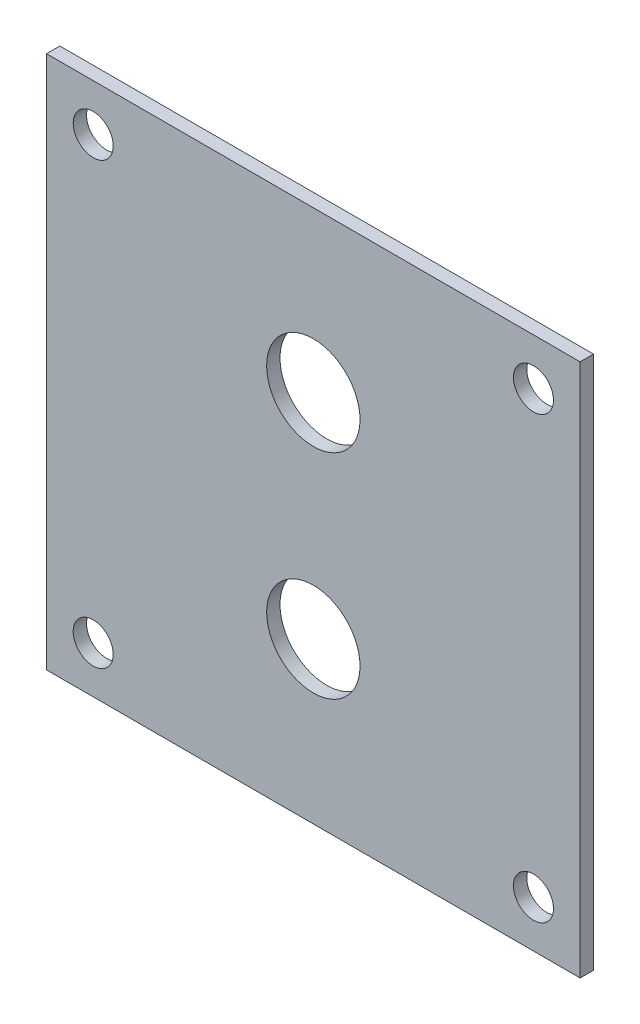
ISO-10303-21;
HEADER;
FILE_DESCRIPTION(('STEP AP214'),'2;1');
FILE_NAME('part.step','',(''),(''),'','','');
FILE_SCHEMA(('AUTOMOTIVE_DESIGN { 1 0 10303 214 1 1 1 1 }'));
ENDSEC;
DATA;
#1=APPLICATION_CONTEXT('core data for automotive mechanical design processes');
#2=APPLICATION_PROTOCOL_DEFINITION('international standard','automotive_design',2000,#1);
#3=PRODUCT_CONTEXT('',#1,'mechanical');
#4=PRODUCT('Part','Part','',(#3));
#5=PRODUCT_RELATED_PRODUCT_CATEGORY('part','',(#4));
#6=PRODUCT_DEFINITION_FORMATION('','',#4);
#7=PRODUCT_DEFINITION_CONTEXT('part definition',#1,'design');
#8=PRODUCT_DEFINITION('design','',#6,#7);
#9=PRODUCT_DEFINITION_SHAPE('','',#8);
#10=(LENGTH_UNIT() NAMED_UNIT(*) SI_UNIT(.MILLI.,.METRE.));
#11=(NAMED_UNIT(*) PLANE_ANGLE_UNIT() SI_UNIT($,.RADIAN.));
#12=(NAMED_UNIT(*) SI_UNIT($,.STERADIAN.) SOLID_ANGLE_UNIT());
#13=UNCERTAINTY_MEASURE_WITH_UNIT(LENGTH_MEASURE(1.E-05),#10,'distance_accuracy_value','');
#14=(GEOMETRIC_REPRESENTATION_CONTEXT(3) GLOBAL_UNCERTAINTY_ASSIGNED_CONTEXT((#13)) GLOBAL_UNIT_ASSIGNED_CONTEXT((#10,
#11,#12)) REPRESENTATION_CONTEXT('',''));
#15=CARTESIAN_POINT('',(0.,0.,0.));
#16=DIRECTION('',(0.,0.,1.));
#17=DIRECTION('',(1.,0.,0.));
#18=AXIS2_PLACEMENT_3D('',#15,#16,#17);
#19=CARTESIAN_POINT('',(63.5,63.5,3.175));
#20=DIRECTION('',(-1.,0.,0.));
#21=DIRECTION('',(0.,-1.,0.));
#22=AXIS2_PLACEMENT_3D('',#19,#20,#21);
#23=PLANE('',#22);
#24=DIRECTION('',(0.,1.,0.));
#25=VECTOR('',#24,1.);
#26=CARTESIAN_POINT('',(63.5,63.5,0.));
#27=LINE('',#26,#25);
#28=CARTESIAN_POINT('',(63.5,-63.5,0.));
#29=VERTEX_POINT('',#28);
#30=CARTESIAN_POINT('',(63.5,63.5,0.));
#31=VERTEX_POINT('',#30);
#32=EDGE_CURVE('E95',#29,#31,#27,.T.);
#33=ORIENTED_EDGE('',*,*,#32,.T.);
#34=DIRECTION('',(0.,0.,-1.));
#35=VECTOR('',#34,1.);
#36=CARTESIAN_POINT('',(63.5,63.5,3.175));
#37=LINE('',#36,#35);
#38=CARTESIAN_POINT('',(63.5,63.5,3.175));
#39=VERTEX_POINT('',#38);
#40=EDGE_CURVE('E11',#39,#31,#37,.T.);
#41=ORIENTED_EDGE('',*,*,#40,.F.);
#42=DIRECTION('',(0.,1.,0.));
#43=VECTOR('',#42,1.);
#44=CARTESIAN_POINT('',(63.5,63.5,3.175));
#45=LINE('',#44,#43);
#46=CARTESIAN_POINT('',(63.5,-63.5,3.175));
#47=VERTEX_POINT('',#46);
#48=EDGE_CURVE('E83',#47,#39,#45,.T.);
#49=ORIENTED_EDGE('',*,*,#48,.F.);
#50=DIRECTION('',(0.,0.,-1.));
#51=VECTOR('',#50,1.);
#52=CARTESIAN_POINT('',(63.5,-63.5,3.175));
#53=LINE('',#52,#51);
#54=EDGE_CURVE('E91',#47,#29,#53,.T.);
#55=ORIENTED_EDGE('',*,*,#54,.T.);
#56=EDGE_LOOP('',(#33,#41,#49,#55));
#57=FACE_BOUND('',#56,.T.);
#58=ADVANCED_FACE('F32',(#57),#23,.F.);
#59=CARTESIAN_POINT('',(-63.5,63.5,3.175));
#60=DIRECTION('',(0.,-1.,0.));
#61=DIRECTION('',(0.,0.,-1.));
#62=AXIS2_PLACEMENT_3D('',#59,#60,#61);
#63=PLANE('',#62);
#64=DIRECTION('',(-1.,0.,0.));
#65=VECTOR('',#64,1.);
#66=CARTESIAN_POINT('',(-63.5,63.5,0.));
#67=LINE('',#66,#65);
#68=CARTESIAN_POINT('',(-63.5,63.5,0.));
#69=VERTEX_POINT('',#68);
#70=EDGE_CURVE('E87',#31,#69,#67,.T.);
#71=ORIENTED_EDGE('',*,*,#70,.T.);
#72=DIRECTION('',(0.,0.,-1.));
#73=VECTOR('',#72,1.);
#74=CARTESIAN_POINT('',(-63.5,63.5,3.175));
#75=LINE('',#74,#73);
#76=CARTESIAN_POINT('',(-63.5,63.5,3.175));
#77=VERTEX_POINT('',#76);
#78=EDGE_CURVE('E40',#77,#69,#75,.T.);
#79=ORIENTED_EDGE('',*,*,#78,.F.);
#80=DIRECTION('',(-1.,0.,0.));
#81=VECTOR('',#80,1.);
#82=CARTESIAN_POINT('',(-63.5,63.5,3.175));
#83=LINE('',#82,#81);
#84=EDGE_CURVE('E78',#39,#77,#83,.T.);
#85=ORIENTED_EDGE('',*,*,#84,.F.);
#86=ORIENTED_EDGE('',*,*,#40,.T.);
#87=EDGE_LOOP('',(#71,#79,#85,#86));
#88=FACE_BOUND('',#87,.T.);
#89=ADVANCED_FACE('F86',(#88),#63,.F.);
#90=CARTESIAN_POINT('',(-63.5,63.5,3.175));
#91=DIRECTION('',(1.,0.,0.));
#92=DIRECTION('',(0.,1.,0.));
#93=AXIS2_PLACEMENT_3D('',#90,#91,#92);
#94=PLANE('',#93);
#95=DIRECTION('',(0.,-1.,0.));
#96=VECTOR('',#95,1.);
#97=CARTESIAN_POINT('',(-63.5,63.5,0.));
#98=LINE('',#97,#96);
#99=CARTESIAN_POINT('',(-63.5,-63.5,0.));
#100=VERTEX_POINT('',#99);
#101=EDGE_CURVE('E65',#69,#100,#98,.T.);
#102=ORIENTED_EDGE('',*,*,#101,.T.);
#103=DIRECTION('',(0.,0.,-1.));
#104=VECTOR('',#103,1.);
#105=CARTESIAN_POINT('',(-63.5,-63.5,3.175));
#106=LINE('',#105,#104);
#107=CARTESIAN_POINT('',(-63.5,-63.5,3.175));
#108=VERTEX_POINT('',#107);
#109=EDGE_CURVE('E88',#108,#100,#106,.T.);
#110=ORIENTED_EDGE('',*,*,#109,.F.);
#111=DIRECTION('',(0.,-1.,0.));
#112=VECTOR('',#111,1.);
#113=CARTESIAN_POINT('',(-63.5,63.5,3.175));
#114=LINE('',#113,#112);
#115=EDGE_CURVE('E81',#77,#108,#114,.T.);
#116=ORIENTED_EDGE('',*,*,#115,.F.);
#117=ORIENTED_EDGE('',*,*,#78,.T.);
#118=EDGE_LOOP('',(#102,#110,#116,#117));
#119=FACE_BOUND('',#118,.T.);
#120=ADVANCED_FACE('F89',(#119),#94,.F.);
#121=CARTESIAN_POINT('',(-63.5,-63.5,3.175));
#122=DIRECTION('',(0.,1.,0.));
#123=DIRECTION('',(0.,0.,1.));
#124=AXIS2_PLACEMENT_3D('',#121,#122,#123);
#125=PLANE('',#124);
#126=DIRECTION('',(1.,0.,0.));
#127=VECTOR('',#126,1.);
#128=CARTESIAN_POINT('',(-63.5,-63.5,0.));
#129=LINE('',#128,#127);
#130=EDGE_CURVE('E71',#100,#29,#129,.T.);
#131=ORIENTED_EDGE('',*,*,#130,.T.);
#132=ORIENTED_EDGE('',*,*,#54,.F.);
#133=DIRECTION('',(1.,0.,0.));
#134=VECTOR('',#133,1.);
#135=CARTESIAN_POINT('',(-63.5,-63.5,3.175));
#136=LINE('',#135,#134);
#137=EDGE_CURVE('E48',#108,#47,#136,.T.);
#138=ORIENTED_EDGE('',*,*,#137,.F.);
#139=ORIENTED_EDGE('',*,*,#109,.T.);
#140=EDGE_LOOP('',(#131,#132,#138,#139));
#141=FACE_BOUND('',#140,.T.);
#142=ADVANCED_FACE('F103',(#141),#125,.F.);
#143=CARTESIAN_POINT('',(0.,0.,3.175));
#144=DIRECTION('',(0.,0.,1.));
#145=DIRECTION('',(1.,0.,0.));
#146=AXIS2_PLACEMENT_3D('',#143,#144,#145);
#147=PLANE('',#146);
#148=CARTESIAN_POINT('',(52.3875,-52.3875,3.175));
#149=DIRECTION('',(0.,0.,1.));
#150=DIRECTION('',(1.,0.,0.));
#151=AXIS2_PLACEMENT_3D('',#148,#149,#150);
#152=CIRCLE('',#151,4.7625);
#153=CARTESIAN_POINT('',(57.15,-52.3875,3.175));
#154=VERTEX_POINT('',#153);
#155=EDGE_CURVE('E138',#154,#154,#152,.F.);
#156=ORIENTED_EDGE('',*,*,#155,.T.);
#157=EDGE_LOOP('',(#156));
#158=FACE_BOUND('',#157,.T.);
#159=CARTESIAN_POINT('',(52.3875,52.3875,3.175));
#160=DIRECTION('',(0.,0.,1.));
#161=DIRECTION('',(1.,0.,0.));
#162=AXIS2_PLACEMENT_3D('',#159,#160,#161);
#163=CIRCLE('',#162,4.7625);
#164=CARTESIAN_POINT('',(57.15,52.3875,3.175));
#165=VERTEX_POINT('',#164);
#166=EDGE_CURVE('E132',#165,#165,#163,.F.);
#167=ORIENTED_EDGE('',*,*,#166,.T.);
#168=EDGE_LOOP('',(#167));
#169=FACE_BOUND('',#168,.T.);
#170=CARTESIAN_POINT('',(-52.3875,-52.3875,3.175));
#171=DIRECTION('',(0.,0.,1.));
#172=DIRECTION('',(1.,0.,0.));
#173=AXIS2_PLACEMENT_3D('',#170,#171,#172);
#174=CIRCLE('',#173,4.7625);
#175=CARTESIAN_POINT('',(-47.625,-52.3875,3.175));
#176=VERTEX_POINT('',#175);
#177=EDGE_CURVE('E126',#176,#176,#174,.F.);
#178=ORIENTED_EDGE('',*,*,#177,.T.);
#179=EDGE_LOOP('',(#178));
#180=FACE_BOUND('',#179,.T.);
#181=CARTESIAN_POINT('',(-52.3875,52.3875,3.175));
#182=DIRECTION('',(0.,0.,1.));
#183=DIRECTION('',(1.,0.,0.));
#184=AXIS2_PLACEMENT_3D('',#181,#182,#183);
#185=CIRCLE('',#184,4.7625);
#186=CARTESIAN_POINT('',(-47.625,52.3875,3.175));
#187=VERTEX_POINT('',#186);
#188=EDGE_CURVE('E120',#187,#187,#185,.F.);
#189=ORIENTED_EDGE('',*,*,#188,.T.);
#190=EDGE_LOOP('',(#189));
#191=FACE_BOUND('',#190,.T.);
#192=CARTESIAN_POINT('',(0.,-25.4,3.175));
#193=DIRECTION('',(0.,0.,1.));
#194=DIRECTION('',(1.,0.,0.));
#195=AXIS2_PLACEMENT_3D('',#192,#193,#194);
#196=CIRCLE('',#195,11.1125);
#197=CARTESIAN_POINT('',(11.1125,-25.4,3.175));
#198=VERTEX_POINT('',#197);
#199=EDGE_CURVE('E114',#198,#198,#196,.F.);
#200=ORIENTED_EDGE('',*,*,#199,.T.);
#201=EDGE_LOOP('',(#200));
#202=FACE_BOUND('',#201,.T.);
#203=CARTESIAN_POINT('',(0.,25.4,3.175));
#204=DIRECTION('',(0.,0.,1.));
#205=DIRECTION('',(1.,0.,0.));
#206=AXIS2_PLACEMENT_3D('',#203,#204,#205);
#207=CIRCLE('',#206,11.1125);
#208=CARTESIAN_POINT('',(11.1125,25.4,3.175));
#209=VERTEX_POINT('',#208);
#210=EDGE_CURVE('E98',#209,#209,#207,.F.);
#211=ORIENTED_EDGE('',*,*,#210,.T.);
#212=EDGE_LOOP('',(#211));
#213=FACE_BOUND('',#212,.T.);
#214=ORIENTED_EDGE('',*,*,#48,.T.);
#215=ORIENTED_EDGE('',*,*,#84,.T.);
#216=ORIENTED_EDGE('',*,*,#115,.T.);
#217=ORIENTED_EDGE('',*,*,#137,.T.);
#218=EDGE_LOOP('',(#214,#215,#216,#217));
#219=FACE_BOUND('',#218,.T.);
#220=ADVANCED_FACE('F79',(#158,#169,#180,#191,#202,#213,#219),#147,.T.);
#221=CARTESIAN_POINT('',(0.,0.,0.));
#222=DIRECTION('',(0.,0.,1.));
#223=DIRECTION('',(1.,0.,0.));
#224=AXIS2_PLACEMENT_3D('',#221,#222,#223);
#225=PLANE('',#224);
#226=CARTESIAN_POINT('',(52.3875,-52.3875,0.));
#227=DIRECTION('',(0.,0.,-1.));
#228=DIRECTION('',(-1.,0.,0.));
#229=AXIS2_PLACEMENT_3D('',#226,#227,#228);
#230=CIRCLE('',#229,4.7625);
#231=CARTESIAN_POINT('',(47.625,-52.3875,0.));
#232=VERTEX_POINT('',#231);
#233=EDGE_CURVE('E141',#232,#232,#230,.T.);
#234=ORIENTED_EDGE('',*,*,#233,.F.);
#235=EDGE_LOOP('',(#234));
#236=FACE_BOUND('',#235,.T.);
#237=CARTESIAN_POINT('',(52.3875,52.3875,0.));
#238=DIRECTION('',(0.,0.,-1.));
#239=DIRECTION('',(1.,0.,0.));
#240=AXIS2_PLACEMENT_3D('',#237,#238,#239);
#241=CIRCLE('',#240,4.7625);
#242=CARTESIAN_POINT('',(57.15,52.3875,0.));
#243=VERTEX_POINT('',#242);
#244=EDGE_CURVE('E135',#243,#243,#241,.T.);
#245=ORIENTED_EDGE('',*,*,#244,.F.);
#246=EDGE_LOOP('',(#245));
#247=FACE_BOUND('',#246,.T.);
#248=CARTESIAN_POINT('',(-52.3875,-52.3875,0.));
#249=DIRECTION('',(0.,0.,-1.));
#250=DIRECTION('',(1.,0.,0.));
#251=AXIS2_PLACEMENT_3D('',#248,#249,#250);
#252=CIRCLE('',#251,4.7625);
#253=CARTESIAN_POINT('',(-47.625,-52.3875,0.));
#254=VERTEX_POINT('',#253);
#255=EDGE_CURVE('E129',#254,#254,#252,.T.);
#256=ORIENTED_EDGE('',*,*,#255,.F.);
#257=EDGE_LOOP('',(#256));
#258=FACE_BOUND('',#257,.T.);
#259=CARTESIAN_POINT('',(-52.3875,52.3875,0.));
#260=DIRECTION('',(0.,0.,-1.));
#261=DIRECTION('',(-1.,0.,0.));
#262=AXIS2_PLACEMENT_3D('',#259,#260,#261);
#263=CIRCLE('',#262,4.7625);
#264=CARTESIAN_POINT('',(-57.15,52.3875,0.));
#265=VERTEX_POINT('',#264);
#266=EDGE_CURVE('E123',#265,#265,#263,.T.);
#267=ORIENTED_EDGE('',*,*,#266,.F.);
#268=EDGE_LOOP('',(#267));
#269=FACE_BOUND('',#268,.T.);
#270=CARTESIAN_POINT('',(0.,-25.4,0.));
#271=DIRECTION('',(0.,0.,-1.));
#272=DIRECTION('',(-1.,0.,0.));
#273=AXIS2_PLACEMENT_3D('',#270,#271,#272);
#274=CIRCLE('',#273,11.1125);
#275=CARTESIAN_POINT('',(-11.1125,-25.4,0.));
#276=VERTEX_POINT('',#275);
#277=EDGE_CURVE('E117',#276,#276,#274,.T.);
#278=ORIENTED_EDGE('',*,*,#277,.F.);
#279=EDGE_LOOP('',(#278));
#280=FACE_BOUND('',#279,.T.);
#281=CARTESIAN_POINT('',(0.,25.4,0.));
#282=DIRECTION('',(0.,0.,-1.));
#283=DIRECTION('',(-1.,0.,0.));
#284=AXIS2_PLACEMENT_3D('',#281,#282,#283);
#285=CIRCLE('',#284,11.1125);
#286=CARTESIAN_POINT('',(-11.1125,25.4,0.));
#287=VERTEX_POINT('',#286);
#288=EDGE_CURVE('E111',#287,#287,#285,.T.);
#289=ORIENTED_EDGE('',*,*,#288,.F.);
#290=EDGE_LOOP('',(#289));
#291=FACE_BOUND('',#290,.T.);
#292=ORIENTED_EDGE('',*,*,#32,.F.);
#293=ORIENTED_EDGE('',*,*,#130,.F.);
#294=ORIENTED_EDGE('',*,*,#101,.F.);
#295=ORIENTED_EDGE('',*,*,#70,.F.);
#296=EDGE_LOOP('',(#292,#293,#294,#295));
#297=FACE_BOUND('',#296,.T.);
#298=ADVANCED_FACE('F106',(#236,#247,#258,#269,#280,#291,#297),#225,.F.);
#299=CARTESIAN_POINT('',(0.,25.4,34.605896423742));
#300=DIRECTION('',(0.,0.,-1.));
#301=DIRECTION('',(-1.,0.,0.));
#302=AXIS2_PLACEMENT_3D('',#299,#300,#301);
#303=CYLINDRICAL_SURFACE('',#302,11.1125);
#304=ORIENTED_EDGE('',*,*,#288,.T.);
#305=EDGE_LOOP('',(#304));
#306=FACE_BOUND('',#305,.T.);
#307=ORIENTED_EDGE('',*,*,#210,.F.);
#308=EDGE_LOOP('',(#307));
#309=FACE_BOUND('',#308,.T.);
#310=ADVANCED_FACE('F150',(#306,#309),#303,.F.);
#311=CARTESIAN_POINT('',(0.,-25.4,34.605896423742));
#312=DIRECTION('',(0.,0.,-1.));
#313=DIRECTION('',(-1.,0.,0.));
#314=AXIS2_PLACEMENT_3D('',#311,#312,#313);
#315=CYLINDRICAL_SURFACE('',#314,11.1125);
#316=ORIENTED_EDGE('',*,*,#277,.T.);
#317=EDGE_LOOP('',(#316));
#318=FACE_BOUND('',#317,.T.);
#319=ORIENTED_EDGE('',*,*,#199,.F.);
#320=EDGE_LOOP('',(#319));
#321=FACE_BOUND('',#320,.T.);
#322=ADVANCED_FACE('F164',(#318,#321),#315,.F.);
#323=CARTESIAN_POINT('',(-52.3875,52.3875,16.6453841816037));
#324=DIRECTION('',(0.,0.,-1.));
#325=DIRECTION('',(-1.,0.,0.));
#326=AXIS2_PLACEMENT_3D('',#323,#324,#325);
#327=CYLINDRICAL_SURFACE('',#326,4.7625);
#328=ORIENTED_EDGE('',*,*,#266,.T.);
#329=EDGE_LOOP('',(#328));
#330=FACE_BOUND('',#329,.T.);
#331=ORIENTED_EDGE('',*,*,#188,.F.);
#332=EDGE_LOOP('',(#331));
#333=FACE_BOUND('',#332,.T.);
#334=ADVANCED_FACE('F206',(#330,#333),#327,.F.);
#335=CARTESIAN_POINT('',(-52.3875,-52.3875,16.6453841816037));
#336=DIRECTION('',(0.,0.,-1.));
#337=DIRECTION('',(-1.,0.,0.));
#338=AXIS2_PLACEMENT_3D('',#335,#336,#337);
#339=CYLINDRICAL_SURFACE('',#338,4.7625);
#340=ORIENTED_EDGE('',*,*,#255,.T.);
#341=EDGE_LOOP('',(#340));
#342=FACE_BOUND('',#341,.T.);
#343=ORIENTED_EDGE('',*,*,#177,.F.);
#344=EDGE_LOOP('',(#343));
#345=FACE_BOUND('',#344,.T.);
#346=ADVANCED_FACE('F225',(#342,#345),#339,.F.);
#347=CARTESIAN_POINT('',(52.3875,52.3875,16.6453841816037));
#348=DIRECTION('',(0.,0.,-1.));
#349=DIRECTION('',(-1.,0.,0.));
#350=AXIS2_PLACEMENT_3D('',#347,#348,#349);
#351=CYLINDRICAL_SURFACE('',#350,4.7625);
#352=ORIENTED_EDGE('',*,*,#244,.T.);
#353=EDGE_LOOP('',(#352));
#354=FACE_BOUND('',#353,.T.);
#355=ORIENTED_EDGE('',*,*,#166,.F.);
#356=EDGE_LOOP('',(#355));
#357=FACE_BOUND('',#356,.T.);
#358=ADVANCED_FACE('F235',(#354,#357),#351,.F.);
#359=CARTESIAN_POINT('',(52.3875,-52.3875,16.6453841816037));
#360=DIRECTION('',(0.,0.,-1.));
#361=DIRECTION('',(-1.,0.,0.));
#362=AXIS2_PLACEMENT_3D('',#359,#360,#361);
#363=CYLINDRICAL_SURFACE('',#362,4.7625);
#364=ORIENTED_EDGE('',*,*,#233,.T.);
#365=EDGE_LOOP('',(#364));
#366=FACE_BOUND('',#365,.T.);
#367=ORIENTED_EDGE('',*,*,#155,.F.);
#368=EDGE_LOOP('',(#367));
#369=FACE_BOUND('',#368,.T.);
#370=ADVANCED_FACE('F145',(#366,#369),#363,.F.);
#371=CLOSED_SHELL('',(#58,#89,#120,#142,#220,#298,#310,#322,#334,#346,#358,#370));
#372=MANIFOLD_SOLID_BREP('B2',#371);
#373=ADVANCED_BREP_SHAPE_REPRESENTATION('',(#18,#372),#14);
#374=SHAPE_DEFINITION_REPRESENTATION(#9,#373);
ENDSEC;
END-ISO-10303-21;
